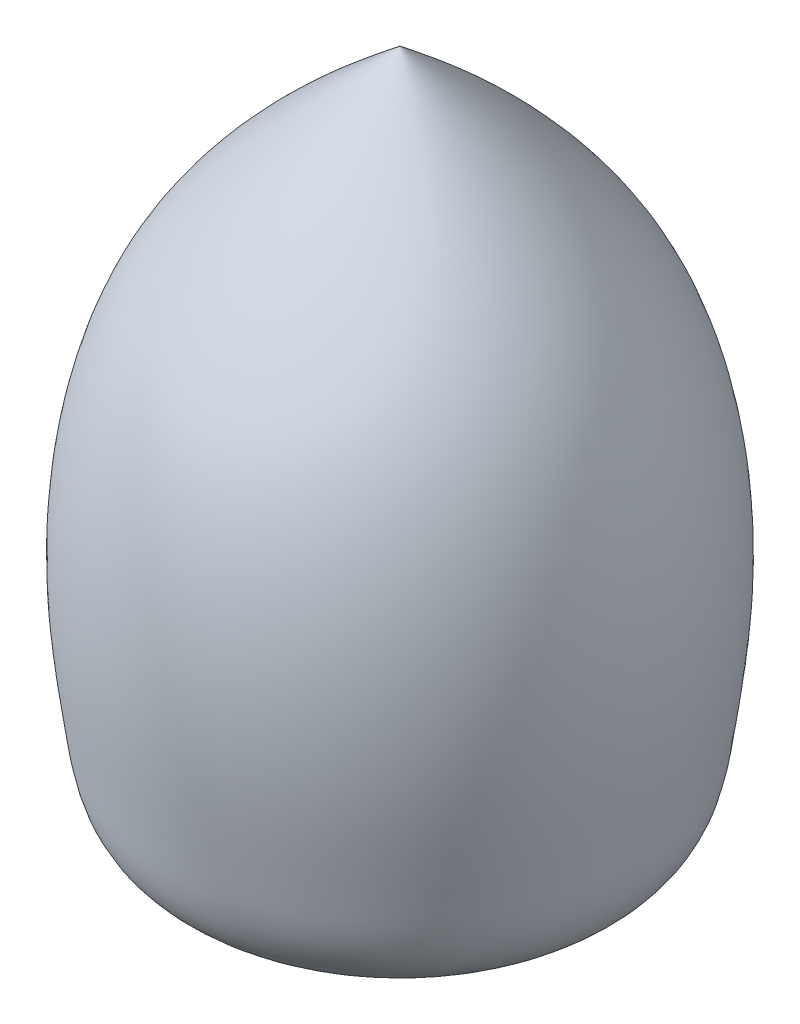
ISO-10303-21;
HEADER;
FILE_DESCRIPTION(('STEP AP214'),'2;1');
FILE_NAME('part.step','',(''),(''),'','','');
FILE_SCHEMA(('AUTOMOTIVE_DESIGN { 1 0 10303 214 1 1 1 1 }'));
ENDSEC;
DATA;
#1=APPLICATION_CONTEXT('core data for automotive mechanical design processes');
#2=APPLICATION_PROTOCOL_DEFINITION('international standard','automotive_design',2000,#1);
#3=PRODUCT_CONTEXT('',#1,'mechanical');
#4=PRODUCT('Part','Part','',(#3));
#5=PRODUCT_RELATED_PRODUCT_CATEGORY('part','',(#4));
#6=PRODUCT_DEFINITION_FORMATION('','',#4);
#7=PRODUCT_DEFINITION_CONTEXT('part definition',#1,'design');
#8=PRODUCT_DEFINITION('design','',#6,#7);
#9=PRODUCT_DEFINITION_SHAPE('','',#8);
#10=(LENGTH_UNIT() NAMED_UNIT(*) SI_UNIT(.MILLI.,.METRE.));
#11=(NAMED_UNIT(*) PLANE_ANGLE_UNIT() SI_UNIT($,.RADIAN.));
#12=(NAMED_UNIT(*) SI_UNIT($,.STERADIAN.) SOLID_ANGLE_UNIT());
#13=UNCERTAINTY_MEASURE_WITH_UNIT(LENGTH_MEASURE(1.E-05),#10,'distance_accuracy_value','');
#14=(GEOMETRIC_REPRESENTATION_CONTEXT(3) GLOBAL_UNCERTAINTY_ASSIGNED_CONTEXT((#13)) GLOBAL_UNIT_ASSIGNED_CONTEXT((#10,
#11,#12)) REPRESENTATION_CONTEXT('',''));
#15=CARTESIAN_POINT('',(0.,0.,0.));
#16=DIRECTION('',(0.,0.,1.));
#17=DIRECTION('',(1.,0.,0.));
#18=AXIS2_PLACEMENT_3D('',#15,#16,#17);
#19=CARTESIAN_POINT('',(0.,0.,0.));
#20=CARTESIAN_POINT('',(0.127362274370244,0.,0.));
#21=CARTESIAN_POINT('',(0.279544699036546,-0.0476290418194396,0.));
#22=CARTESIAN_POINT('',(0.563104228547571,-0.0462091706978044,0.));
#23=CARTESIAN_POINT('',(0.720754248002561,-0.0211847943915662,0.));
#24=CARTESIAN_POINT('',(0.850142368645407,0.,0.));
#25=B_SPLINE_CURVE_WITH_KNOTS('',3,(#19,#20,#21,#22,#23,#24),.UNSPECIFIED.,.F.,.F.,(4,1,1,4),
(0.,0.443530430905879,0.543530430905879,1.),.UNSPECIFIED.);
#26=CARTESIAN_POINT('',(0.,0.,0.));
#27=DIRECTION('',(0.,-1.,0.));
#28=AXIS1_PLACEMENT('',#26,#27);
#29=SURFACE_OF_REVOLUTION('',#25,#28);
#30=CARTESIAN_POINT('',(0.,0.,0.));
#31=DIRECTION('',(0.,-1.,0.));
#32=DIRECTION('',(1.,0.,0.));
#33=AXIS2_PLACEMENT_3D('',#30,#31,#32);
#34=CIRCLE('',#33,0.850142368645407);
#35=CARTESIAN_POINT('',(0.850142368645407,0.,0.));
#36=VERTEX_POINT('',#35);
#37=EDGE_CURVE('E11',#36,#36,#34,.T.);
#38=ORIENTED_EDGE('',*,*,#37,.T.);
#39=EDGE_LOOP('',(#38));
#40=FACE_BOUND('',#39,.T.);
#41=CARTESIAN_POINT('',(0.,0.,0.));
#42=VERTEX_POINT('',#41);
#43=VERTEX_LOOP('',#42);
#44=FACE_BOUND('',#43,.T.);
#45=ADVANCED_FACE('F30',(#40,#44),#29,.F.);
#46=CARTESIAN_POINT('',(0.850142368645407,0.,0.));
#47=DIRECTION('',(0.,-1.,0.));
#48=DIRECTION('',(1.,0.,0.));
#49=AXIS2_PLACEMENT_3D('',#46,#47,#48);
#50=PLANE('',#49);
#51=CARTESIAN_POINT('',(0.,0.,0.));
#52=DIRECTION('',(0.,-1.,0.));
#53=DIRECTION('',(1.,0.,0.));
#54=AXIS2_PLACEMENT_3D('',#51,#52,#53);
#55=CIRCLE('',#54,1.07703190023907);
#56=CARTESIAN_POINT('',(1.07703190023907,0.,0.));
#57=VERTEX_POINT('',#56);
#58=EDGE_CURVE('E38',#57,#57,#55,.T.);
#59=ORIENTED_EDGE('',*,*,#58,.T.);
#60=EDGE_LOOP('',(#59));
#61=FACE_BOUND('',#60,.T.);
#62=ORIENTED_EDGE('',*,*,#37,.F.);
#63=EDGE_LOOP('',(#62));
#64=FACE_BOUND('',#63,.T.);
#65=ADVANCED_FACE('F47',(#61,#64),#50,.T.);
#66=CARTESIAN_POINT('',(1.07703190023907,0.,0.));
#67=CARTESIAN_POINT('',(1.20668690189783,0.00579013187937418,0.));
#68=CARTESIAN_POINT('',(1.45497046064472,0.0168779767772387,0.));
#69=CARTESIAN_POINT('',(1.83375620343802,0.302263080804917,0.));
#70=CARTESIAN_POINT('',(1.91964668371438,0.908035539498047,0.));
#71=CARTESIAN_POINT('',(2.08392835232842,2.06297609847285,0.));
#72=CARTESIAN_POINT('',(1.83750714249022,3.98934222155624,0.));
#73=CARTESIAN_POINT('',(0.625856647458982,4.98546855094488,0.));
#74=CARTESIAN_POINT('',(0.,5.50000000000001,0.));
#75=B_SPLINE_CURVE_WITH_KNOTS('',3,(#66,#67,#68,#69,#70,#71,#72,#73,#74),.UNSPECIFIED.,.F.,.F.,
(4,1,1,1,1,1,4),(0.,0.0574557611705301,0.110025225956775,0.197662421216628,0.316902329297238,
0.647157971852232,1.),.UNSPECIFIED.);
#76=CARTESIAN_POINT('',(0.,0.,0.));
#77=DIRECTION('',(0.,-1.,0.));
#78=AXIS1_PLACEMENT('',#76,#77);
#79=SURFACE_OF_REVOLUTION('',#75,#78);
#80=CARTESIAN_POINT('',(0.,5.50000000000001,0.));
#81=VERTEX_POINT('',#80);
#82=VERTEX_LOOP('',#81);
#83=FACE_BOUND('',#82,.T.);
#84=ORIENTED_EDGE('',*,*,#58,.F.);
#85=EDGE_LOOP('',(#84));
#86=FACE_BOUND('',#85,.T.);
#87=ADVANCED_FACE('F44',(#83,#86),#79,.F.);
#88=CLOSED_SHELL('',(#45,#65,#87));
#89=MANIFOLD_SOLID_BREP('B2',#88);
#90=ADVANCED_BREP_SHAPE_REPRESENTATION('',(#18,#89),#14);
#91=SHAPE_DEFINITION_REPRESENTATION(#9,#90);
ENDSEC;
END-ISO-10303-21;
